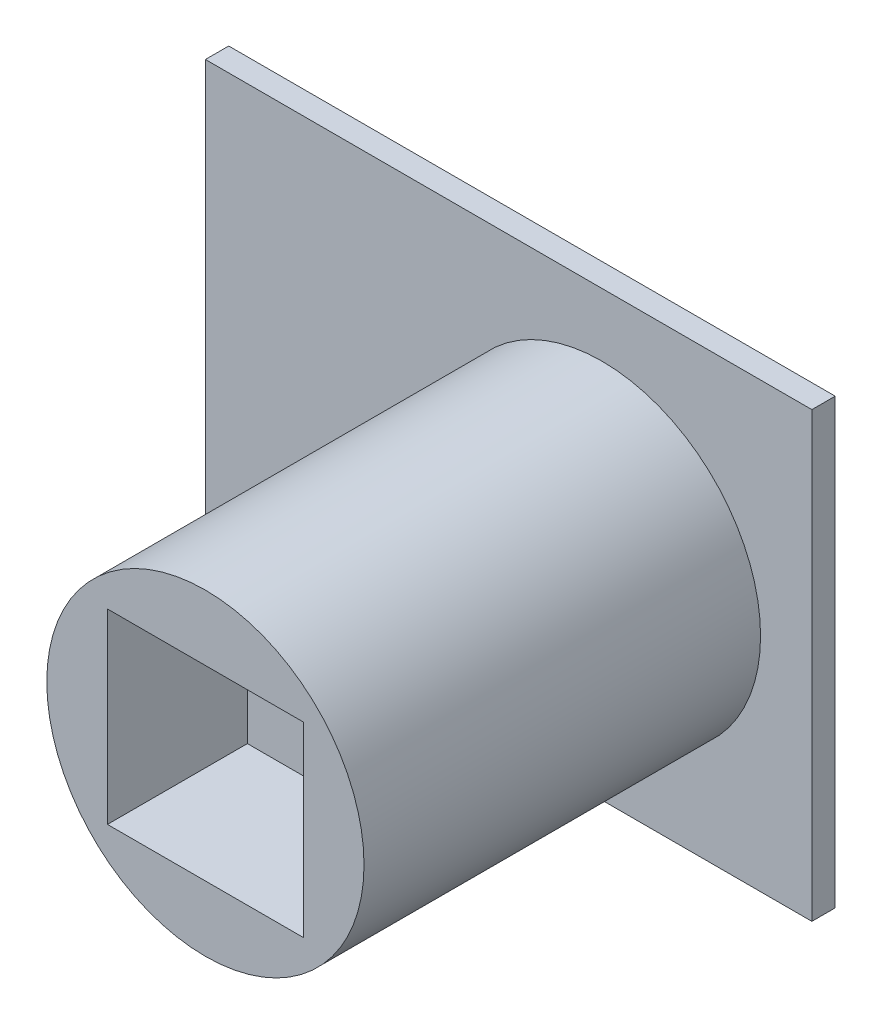
ISO-10303-21;
HEADER;
FILE_DESCRIPTION(('STEP AP214'),'2;1');
FILE_NAME('part.step','',(''),(''),'','','');
FILE_SCHEMA(('AUTOMOTIVE_DESIGN { 1 0 10303 214 1 1 1 1 }'));
ENDSEC;
DATA;
#1=APPLICATION_CONTEXT('core data for automotive mechanical design processes');
#2=APPLICATION_PROTOCOL_DEFINITION('international standard','automotive_design',2000,#1);
#3=PRODUCT_CONTEXT('',#1,'mechanical');
#4=PRODUCT('Part','Part','',(#3));
#5=PRODUCT_RELATED_PRODUCT_CATEGORY('part','',(#4));
#6=PRODUCT_DEFINITION_FORMATION('','',#4);
#7=PRODUCT_DEFINITION_CONTEXT('part definition',#1,'design');
#8=PRODUCT_DEFINITION('design','',#6,#7);
#9=PRODUCT_DEFINITION_SHAPE('','',#8);
#10=(LENGTH_UNIT() NAMED_UNIT(*) SI_UNIT(.MILLI.,.METRE.));
#11=(NAMED_UNIT(*) PLANE_ANGLE_UNIT() SI_UNIT($,.RADIAN.));
#12=(NAMED_UNIT(*) SI_UNIT($,.STERADIAN.) SOLID_ANGLE_UNIT());
#13=UNCERTAINTY_MEASURE_WITH_UNIT(LENGTH_MEASURE(1.E-05),#10,'distance_accuracy_value','');
#14=(GEOMETRIC_REPRESENTATION_CONTEXT(3) GLOBAL_UNCERTAINTY_ASSIGNED_CONTEXT((#13)) GLOBAL_UNIT_ASSIGNED_CONTEXT((#10,
#11,#12)) REPRESENTATION_CONTEXT('',''));
#15=CARTESIAN_POINT('',(0.,0.,0.));
#16=DIRECTION('',(0.,0.,1.));
#17=DIRECTION('',(1.,0.,0.));
#18=AXIS2_PLACEMENT_3D('',#15,#16,#17);
#19=CARTESIAN_POINT('',(65.,-47.5,5.));
#20=DIRECTION('',(-1.,0.,0.));
#21=DIRECTION('',(0.,0.,1.));
#22=AXIS2_PLACEMENT_3D('',#19,#20,#21);
#23=PLANE('',#22);
#24=DIRECTION('',(0.,1.,0.));
#25=VECTOR('',#24,1.);
#26=CARTESIAN_POINT('',(65.,-47.5,0.));
#27=LINE('',#26,#25);
#28=CARTESIAN_POINT('',(65.,-47.5,0.));
#29=VERTEX_POINT('',#28);
#30=CARTESIAN_POINT('',(65.,47.5,0.));
#31=VERTEX_POINT('',#30);
#32=EDGE_CURVE('E155',#29,#31,#27,.T.);
#33=ORIENTED_EDGE('',*,*,#32,.T.);
#34=DIRECTION('',(0.,0.,-1.));
#35=VECTOR('',#34,1.);
#36=CARTESIAN_POINT('',(65.,47.5,5.));
#37=LINE('',#36,#35);
#38=CARTESIAN_POINT('',(65.,47.5,5.));
#39=VERTEX_POINT('',#38);
#40=EDGE_CURVE('E43',#39,#31,#37,.T.);
#41=ORIENTED_EDGE('',*,*,#40,.F.);
#42=DIRECTION('',(0.,1.,0.));
#43=VECTOR('',#42,1.);
#44=CARTESIAN_POINT('',(65.,-47.5,5.));
#45=LINE('',#44,#43);
#46=CARTESIAN_POINT('',(65.,-47.5,5.));
#47=VERTEX_POINT('',#46);
#48=EDGE_CURVE('E157',#47,#39,#45,.T.);
#49=ORIENTED_EDGE('',*,*,#48,.F.);
#50=DIRECTION('',(0.,0.,-1.));
#51=VECTOR('',#50,1.);
#52=CARTESIAN_POINT('',(65.,-47.5,5.));
#53=LINE('',#52,#51);
#54=EDGE_CURVE('E163',#47,#29,#53,.T.);
#55=ORIENTED_EDGE('',*,*,#54,.T.);
#56=EDGE_LOOP('',(#33,#41,#49,#55));
#57=FACE_BOUND('',#56,.T.);
#58=ADVANCED_FACE('F40',(#57),#23,.F.);
#59=CARTESIAN_POINT('',(-65.,47.5,5.));
#60=DIRECTION('',(0.,-1.,0.));
#61=DIRECTION('',(0.,0.,-1.));
#62=AXIS2_PLACEMENT_3D('',#59,#60,#61);
#63=PLANE('',#62);
#64=DIRECTION('',(-1.,0.,0.));
#65=VECTOR('',#64,1.);
#66=CARTESIAN_POINT('',(-65.,47.5,0.));
#67=LINE('',#66,#65);
#68=CARTESIAN_POINT('',(-65.,47.5,0.));
#69=VERTEX_POINT('',#68);
#70=EDGE_CURVE('E166',#31,#69,#67,.T.);
#71=ORIENTED_EDGE('',*,*,#70,.T.);
#72=DIRECTION('',(0.,0.,-1.));
#73=VECTOR('',#72,1.);
#74=CARTESIAN_POINT('',(-65.,47.5,5.));
#75=LINE('',#74,#73);
#76=CARTESIAN_POINT('',(-65.,47.5,5.));
#77=VERTEX_POINT('',#76);
#78=EDGE_CURVE('E173',#77,#69,#75,.T.);
#79=ORIENTED_EDGE('',*,*,#78,.F.);
#80=DIRECTION('',(-1.,0.,0.));
#81=VECTOR('',#80,1.);
#82=CARTESIAN_POINT('',(-65.,47.5,5.));
#83=LINE('',#82,#81);
#84=EDGE_CURVE('E93',#39,#77,#83,.T.);
#85=ORIENTED_EDGE('',*,*,#84,.F.);
#86=ORIENTED_EDGE('',*,*,#40,.T.);
#87=EDGE_LOOP('',(#71,#79,#85,#86));
#88=FACE_BOUND('',#87,.T.);
#89=ADVANCED_FACE('F179',(#88),#63,.F.);
#90=CARTESIAN_POINT('',(-65.,-47.5,5.));
#91=DIRECTION('',(1.,0.,0.));
#92=DIRECTION('',(0.,0.,-1.));
#93=AXIS2_PLACEMENT_3D('',#90,#91,#92);
#94=PLANE('',#93);
#95=DIRECTION('',(0.,-1.,0.));
#96=VECTOR('',#95,1.);
#97=CARTESIAN_POINT('',(-65.,-47.5,0.));
#98=LINE('',#97,#96);
#99=CARTESIAN_POINT('',(-65.,-47.5,0.));
#100=VERTEX_POINT('',#99);
#101=EDGE_CURVE('E168',#69,#100,#98,.T.);
#102=ORIENTED_EDGE('',*,*,#101,.T.);
#103=DIRECTION('',(0.,0.,-1.));
#104=VECTOR('',#103,1.);
#105=CARTESIAN_POINT('',(-65.,-47.5,5.));
#106=LINE('',#105,#104);
#107=CARTESIAN_POINT('',(-65.,-47.5,5.));
#108=VERTEX_POINT('',#107);
#109=EDGE_CURVE('E172',#108,#100,#106,.T.);
#110=ORIENTED_EDGE('',*,*,#109,.F.);
#111=DIRECTION('',(0.,-1.,0.));
#112=VECTOR('',#111,1.);
#113=CARTESIAN_POINT('',(-65.,-47.5,5.));
#114=LINE('',#113,#112);
#115=EDGE_CURVE('E160',#77,#108,#114,.T.);
#116=ORIENTED_EDGE('',*,*,#115,.F.);
#117=ORIENTED_EDGE('',*,*,#78,.T.);
#118=EDGE_LOOP('',(#102,#110,#116,#117));
#119=FACE_BOUND('',#118,.T.);
#120=ADVANCED_FACE('F186',(#119),#94,.F.);
#121=CARTESIAN_POINT('',(-65.,-47.5,5.));
#122=DIRECTION('',(0.,1.,0.));
#123=DIRECTION('',(0.,0.,1.));
#124=AXIS2_PLACEMENT_3D('',#121,#122,#123);
#125=PLANE('',#124);
#126=DIRECTION('',(1.,0.,0.));
#127=VECTOR('',#126,1.);
#128=CARTESIAN_POINT('',(-65.,-47.5,0.));
#129=LINE('',#128,#127);
#130=EDGE_CURVE('E85',#100,#29,#129,.T.);
#131=ORIENTED_EDGE('',*,*,#130,.T.);
#132=ORIENTED_EDGE('',*,*,#54,.F.);
#133=DIRECTION('',(1.,0.,0.));
#134=VECTOR('',#133,1.);
#135=CARTESIAN_POINT('',(-65.,-47.5,5.));
#136=LINE('',#135,#134);
#137=EDGE_CURVE('E64',#108,#47,#136,.T.);
#138=ORIENTED_EDGE('',*,*,#137,.F.);
#139=ORIENTED_EDGE('',*,*,#109,.T.);
#140=EDGE_LOOP('',(#131,#132,#138,#139));
#141=FACE_BOUND('',#140,.T.);
#142=ADVANCED_FACE('F187',(#141),#125,.F.);
#143=CARTESIAN_POINT('',(0.,0.,5.));
#144=DIRECTION('',(0.,0.,-1.));
#145=DIRECTION('',(-1.,0.,0.));
#146=AXIS2_PLACEMENT_3D('',#143,#144,#145);
#147=PLANE('',#146);
#148=CARTESIAN_POINT('',(20.,0.,5.));
#149=DIRECTION('',(0.,0.,1.));
#150=DIRECTION('',(1.,0.,0.));
#151=AXIS2_PLACEMENT_3D('',#148,#149,#150);
#152=CIRCLE('',#151,34.);
#153=CARTESIAN_POINT('',(54.,0.,5.));
#154=VERTEX_POINT('',#153);
#155=EDGE_CURVE('E11',#154,#154,#152,.T.);
#156=ORIENTED_EDGE('',*,*,#155,.F.);
#157=EDGE_LOOP('',(#156));
#158=FACE_BOUND('',#157,.T.);
#159=ORIENTED_EDGE('',*,*,#48,.T.);
#160=ORIENTED_EDGE('',*,*,#84,.T.);
#161=ORIENTED_EDGE('',*,*,#115,.T.);
#162=ORIENTED_EDGE('',*,*,#137,.T.);
#163=EDGE_LOOP('',(#159,#160,#161,#162));
#164=FACE_BOUND('',#163,.T.);
#165=ADVANCED_FACE('F188',(#158,#164),#147,.F.);
#166=CARTESIAN_POINT('',(0.,0.,0.));
#167=DIRECTION('',(0.,0.,-1.));
#168=DIRECTION('',(-1.,0.,0.));
#169=AXIS2_PLACEMENT_3D('',#166,#167,#168);
#170=PLANE('',#169);
#171=ORIENTED_EDGE('',*,*,#32,.F.);
#172=ORIENTED_EDGE('',*,*,#130,.F.);
#173=ORIENTED_EDGE('',*,*,#101,.F.);
#174=ORIENTED_EDGE('',*,*,#70,.F.);
#175=EDGE_LOOP('',(#171,#172,#173,#174));
#176=FACE_BOUND('',#175,.T.);
#177=ADVANCED_FACE('F184',(#176),#170,.T.);
#178=CARTESIAN_POINT('',(20.,0.,90.));
#179=DIRECTION('',(0.,0.,-1.));
#180=DIRECTION('',(-1.,0.,0.));
#181=AXIS2_PLACEMENT_3D('',#178,#179,#180);
#182=CYLINDRICAL_SURFACE('',#181,34.);
#183=CARTESIAN_POINT('',(20.,0.,90.));
#184=DIRECTION('',(0.,0.,1.));
#185=DIRECTION('',(1.,0.,0.));
#186=AXIS2_PLACEMENT_3D('',#183,#184,#185);
#187=CIRCLE('',#186,34.);
#188=CARTESIAN_POINT('',(54.,0.,90.));
#189=VERTEX_POINT('',#188);
#190=EDGE_CURVE('E150',#189,#189,#187,.T.);
#191=ORIENTED_EDGE('',*,*,#190,.F.);
#192=EDGE_LOOP('',(#191));
#193=FACE_BOUND('',#192,.T.);
#194=ORIENTED_EDGE('',*,*,#155,.T.);
#195=EDGE_LOOP('',(#194));
#196=FACE_BOUND('',#195,.T.);
#197=ADVANCED_FACE('F196',(#193,#196),#182,.T.);
#198=CARTESIAN_POINT('',(20.,0.,90.));
#199=DIRECTION('',(0.,0.,1.));
#200=DIRECTION('',(1.,0.,0.));
#201=AXIS2_PLACEMENT_3D('',#198,#199,#200);
#202=PLANE('',#201);
#203=DIRECTION('',(0.,1.,0.));
#204=VECTOR('',#203,1.);
#205=CARTESIAN_POINT('',(41.,-20.,90.));
#206=LINE('',#205,#204);
#207=CARTESIAN_POINT('',(41.,-20.,90.));
#208=VERTEX_POINT('',#207);
#209=CARTESIAN_POINT('',(41.,20.,90.));
#210=VERTEX_POINT('',#209);
#211=EDGE_CURVE('E55',#208,#210,#206,.T.);
#212=ORIENTED_EDGE('',*,*,#211,.F.);
#213=DIRECTION('',(1.,0.,0.));
#214=VECTOR('',#213,1.);
#215=CARTESIAN_POINT('',(-0.999999999999994,-20.,90.));
#216=LINE('',#215,#214);
#217=CARTESIAN_POINT('',(-0.999999999999994,-20.,90.));
#218=VERTEX_POINT('',#217);
#219=EDGE_CURVE('E135',#218,#208,#216,.T.);
#220=ORIENTED_EDGE('',*,*,#219,.F.);
#221=DIRECTION('',(0.,-1.,0.));
#222=VECTOR('',#221,1.);
#223=CARTESIAN_POINT('',(-0.999999999999994,-20.,90.));
#224=LINE('',#223,#222);
#225=CARTESIAN_POINT('',(-0.999999999999994,20.,90.));
#226=VERTEX_POINT('',#225);
#227=EDGE_CURVE('E138',#226,#218,#224,.T.);
#228=ORIENTED_EDGE('',*,*,#227,.F.);
#229=DIRECTION('',(-1.,0.,0.));
#230=VECTOR('',#229,1.);
#231=CARTESIAN_POINT('',(-0.999999999999994,20.,90.));
#232=LINE('',#231,#230);
#233=EDGE_CURVE('E144',#210,#226,#232,.T.);
#234=ORIENTED_EDGE('',*,*,#233,.F.);
#235=EDGE_LOOP('',(#212,#220,#228,#234));
#236=FACE_BOUND('',#235,.T.);
#237=ORIENTED_EDGE('',*,*,#190,.T.);
#238=EDGE_LOOP('',(#237));
#239=FACE_BOUND('',#238,.T.);
#240=ADVANCED_FACE('F237',(#236,#239),#202,.T.);
#241=CARTESIAN_POINT('',(41.,-20.,60.));
#242=DIRECTION('',(1.,0.,0.));
#243=DIRECTION('',(0.,0.,-1.));
#244=AXIS2_PLACEMENT_3D('',#241,#242,#243);
#245=PLANE('',#244);
#246=ORIENTED_EDGE('',*,*,#211,.T.);
#247=DIRECTION('',(0.,0.,1.));
#248=VECTOR('',#247,1.);
#249=CARTESIAN_POINT('',(41.,20.,60.));
#250=LINE('',#249,#248);
#251=CARTESIAN_POINT('',(41.,20.,60.));
#252=VERTEX_POINT('',#251);
#253=EDGE_CURVE('E113',#252,#210,#250,.T.);
#254=ORIENTED_EDGE('',*,*,#253,.F.);
#255=DIRECTION('',(0.,1.,0.));
#256=VECTOR('',#255,1.);
#257=CARTESIAN_POINT('',(41.,-20.,60.));
#258=LINE('',#257,#256);
#259=CARTESIAN_POINT('',(41.,-20.,60.));
#260=VERTEX_POINT('',#259);
#261=EDGE_CURVE('E117',#260,#252,#258,.T.);
#262=ORIENTED_EDGE('',*,*,#261,.F.);
#263=DIRECTION('',(0.,0.,1.));
#264=VECTOR('',#263,1.);
#265=CARTESIAN_POINT('',(41.,-20.,60.));
#266=LINE('',#265,#264);
#267=EDGE_CURVE('E148',#260,#208,#266,.T.);
#268=ORIENTED_EDGE('',*,*,#267,.T.);
#269=EDGE_LOOP('',(#246,#254,#262,#268));
#270=FACE_BOUND('',#269,.T.);
#271=ADVANCED_FACE('F115',(#270),#245,.F.);
#272=CARTESIAN_POINT('',(-0.999999999999994,-20.,60.));
#273=DIRECTION('',(0.,-1.,0.));
#274=DIRECTION('',(0.,0.,-1.));
#275=AXIS2_PLACEMENT_3D('',#272,#273,#274);
#276=PLANE('',#275);
#277=ORIENTED_EDGE('',*,*,#219,.T.);
#278=ORIENTED_EDGE('',*,*,#267,.F.);
#279=DIRECTION('',(1.,0.,0.));
#280=VECTOR('',#279,1.);
#281=CARTESIAN_POINT('',(-0.999999999999994,-20.,60.));
#282=LINE('',#281,#280);
#283=CARTESIAN_POINT('',(-0.999999999999994,-20.,60.));
#284=VERTEX_POINT('',#283);
#285=EDGE_CURVE('E123',#284,#260,#282,.T.);
#286=ORIENTED_EDGE('',*,*,#285,.F.);
#287=DIRECTION('',(0.,0.,1.));
#288=VECTOR('',#287,1.);
#289=CARTESIAN_POINT('',(-0.999999999999994,-20.,60.));
#290=LINE('',#289,#288);
#291=EDGE_CURVE('E151',#284,#218,#290,.T.);
#292=ORIENTED_EDGE('',*,*,#291,.T.);
#293=EDGE_LOOP('',(#277,#278,#286,#292));
#294=FACE_BOUND('',#293,.T.);
#295=ADVANCED_FACE('F257',(#294),#276,.F.);
#296=CARTESIAN_POINT('',(-0.999999999999994,-20.,60.));
#297=DIRECTION('',(-1.,0.,0.));
#298=DIRECTION('',(0.,0.,1.));
#299=AXIS2_PLACEMENT_3D('',#296,#297,#298);
#300=PLANE('',#299);
#301=ORIENTED_EDGE('',*,*,#227,.T.);
#302=ORIENTED_EDGE('',*,*,#291,.F.);
#303=DIRECTION('',(0.,-1.,0.));
#304=VECTOR('',#303,1.);
#305=CARTESIAN_POINT('',(-0.999999999999994,-20.,60.));
#306=LINE('',#305,#304);
#307=CARTESIAN_POINT('',(-0.999999999999994,20.,60.));
#308=VERTEX_POINT('',#307);
#309=EDGE_CURVE('E131',#308,#284,#306,.T.);
#310=ORIENTED_EDGE('',*,*,#309,.F.);
#311=DIRECTION('',(0.,0.,1.));
#312=VECTOR('',#311,1.);
#313=CARTESIAN_POINT('',(-0.999999999999994,20.,60.));
#314=LINE('',#313,#312);
#315=EDGE_CURVE('E122',#308,#226,#314,.T.);
#316=ORIENTED_EDGE('',*,*,#315,.T.);
#317=EDGE_LOOP('',(#301,#302,#310,#316));
#318=FACE_BOUND('',#317,.T.);
#319=ADVANCED_FACE('F267',(#318),#300,.F.);
#320=CARTESIAN_POINT('',(-0.999999999999994,20.,60.));
#321=DIRECTION('',(0.,1.,0.));
#322=DIRECTION('',(0.,0.,1.));
#323=AXIS2_PLACEMENT_3D('',#320,#321,#322);
#324=PLANE('',#323);
#325=ORIENTED_EDGE('',*,*,#233,.T.);
#326=ORIENTED_EDGE('',*,*,#315,.F.);
#327=DIRECTION('',(-1.,0.,0.));
#328=VECTOR('',#327,1.);
#329=CARTESIAN_POINT('',(-0.999999999999994,20.,60.));
#330=LINE('',#329,#328);
#331=EDGE_CURVE('E126',#252,#308,#330,.T.);
#332=ORIENTED_EDGE('',*,*,#331,.F.);
#333=ORIENTED_EDGE('',*,*,#253,.T.);
#334=EDGE_LOOP('',(#325,#326,#332,#333));
#335=FACE_BOUND('',#334,.T.);
#336=ADVANCED_FACE('F127',(#335),#324,.F.);
#337=CARTESIAN_POINT('',(0.,0.,60.));
#338=DIRECTION('',(0.,0.,-1.));
#339=DIRECTION('',(-1.,0.,0.));
#340=AXIS2_PLACEMENT_3D('',#337,#338,#339);
#341=PLANE('',#340);
#342=ORIENTED_EDGE('',*,*,#261,.T.);
#343=ORIENTED_EDGE('',*,*,#331,.T.);
#344=ORIENTED_EDGE('',*,*,#309,.T.);
#345=ORIENTED_EDGE('',*,*,#285,.T.);
#346=EDGE_LOOP('',(#342,#343,#344,#345));
#347=FACE_BOUND('',#346,.T.);
#348=ADVANCED_FACE('F133',(#347),#341,.F.);
#349=CLOSED_SHELL('',(#58,#89,#120,#142,#165,#177,#197,#240,#271,#295,#319,#336,#348));
#350=MANIFOLD_SOLID_BREP('B2',#349);
#351=ADVANCED_BREP_SHAPE_REPRESENTATION('',(#18,#350),#14);
#352=SHAPE_DEFINITION_REPRESENTATION(#9,#351);
ENDSEC;
END-ISO-10303-21;
